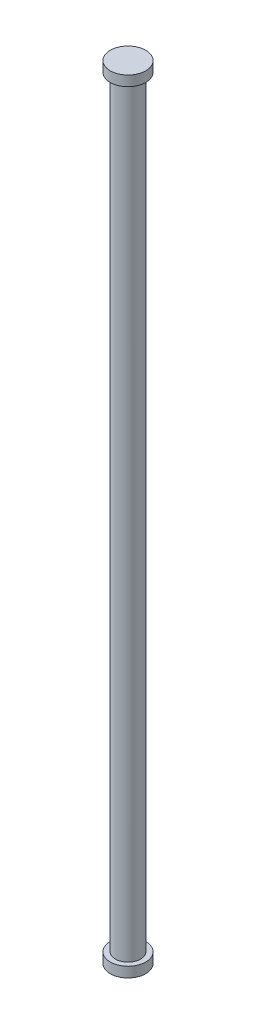
ISO-10303-21;
HEADER;
FILE_DESCRIPTION(('STEP AP214'),'2;1');
FILE_NAME('part.step','',(''),(''),'','','');
FILE_SCHEMA(('AUTOMOTIVE_DESIGN { 1 0 10303 214 1 1 1 1 }'));
ENDSEC;
DATA;
#1=APPLICATION_CONTEXT('core data for automotive mechanical design processes');
#2=APPLICATION_PROTOCOL_DEFINITION('international standard','automotive_design',2000,#1);
#3=PRODUCT_CONTEXT('',#1,'mechanical');
#4=PRODUCT('Part','Part','',(#3));
#5=PRODUCT_RELATED_PRODUCT_CATEGORY('part','',(#4));
#6=PRODUCT_DEFINITION_FORMATION('','',#4);
#7=PRODUCT_DEFINITION_CONTEXT('part definition',#1,'design');
#8=PRODUCT_DEFINITION('design','',#6,#7);
#9=PRODUCT_DEFINITION_SHAPE('','',#8);
#10=(LENGTH_UNIT() NAMED_UNIT(*) SI_UNIT(.MILLI.,.METRE.));
#11=(NAMED_UNIT(*) PLANE_ANGLE_UNIT() SI_UNIT($,.RADIAN.));
#12=(NAMED_UNIT(*) SI_UNIT($,.STERADIAN.) SOLID_ANGLE_UNIT());
#13=UNCERTAINTY_MEASURE_WITH_UNIT(LENGTH_MEASURE(1.E-05),#10,'distance_accuracy_value','');
#14=(GEOMETRIC_REPRESENTATION_CONTEXT(3) GLOBAL_UNCERTAINTY_ASSIGNED_CONTEXT((#13)) GLOBAL_UNIT_ASSIGNED_CONTEXT((#10,
#11,#12)) REPRESENTATION_CONTEXT('',''));
#15=CARTESIAN_POINT('',(0.,0.,0.));
#16=DIRECTION('',(0.,0.,1.));
#17=DIRECTION('',(1.,0.,0.));
#18=AXIS2_PLACEMENT_3D('',#15,#16,#17);
#19=CARTESIAN_POINT('',(0.,154.,0.));
#20=DIRECTION('',(0.,-1.,0.));
#21=DIRECTION('',(0.,0.,-1.));
#22=AXIS2_PLACEMENT_3D('',#19,#20,#21);
#23=CYLINDRICAL_SURFACE('',#22,2.5);
#24=CARTESIAN_POINT('',(0.,2.,0.));
#25=DIRECTION('',(0.,-1.,0.));
#26=DIRECTION('',(0.,0.,-1.));
#27=AXIS2_PLACEMENT_3D('',#24,#25,#26);
#28=CIRCLE('',#27,2.5);
#29=CARTESIAN_POINT('',(0.,2.,-2.5));
#30=VERTEX_POINT('',#29);
#31=EDGE_CURVE('E44',#30,#30,#28,.T.);
#32=ORIENTED_EDGE('',*,*,#31,.F.);
#33=EDGE_LOOP('',(#32));
#34=FACE_BOUND('',#33,.T.);
#35=CARTESIAN_POINT('',(0.,152.,0.));
#36=DIRECTION('',(0.,1.,0.));
#37=DIRECTION('',(0.,0.,1.));
#38=AXIS2_PLACEMENT_3D('',#35,#36,#37);
#39=CIRCLE('',#38,2.5);
#40=CARTESIAN_POINT('',(0.,152.,2.5));
#41=VERTEX_POINT('',#40);
#42=EDGE_CURVE('E10',#41,#41,#39,.T.);
#43=ORIENTED_EDGE('',*,*,#42,.F.);
#44=EDGE_LOOP('',(#43));
#45=FACE_BOUND('',#44,.T.);
#46=ADVANCED_FACE('F37',(#34,#45),#23,.T.);
#47=CARTESIAN_POINT('',(0.,2.,0.));
#48=DIRECTION('',(0.,-1.,0.));
#49=DIRECTION('',(0.,0.,-1.));
#50=AXIS2_PLACEMENT_3D('',#47,#48,#49);
#51=CYLINDRICAL_SURFACE('',#50,3.5);
#52=CARTESIAN_POINT('',(0.,2.,0.));
#53=DIRECTION('',(0.,-1.,0.));
#54=DIRECTION('',(0.,0.,-1.));
#55=AXIS2_PLACEMENT_3D('',#52,#53,#54);
#56=CIRCLE('',#55,3.5);
#57=CARTESIAN_POINT('',(0.,2.,-3.5));
#58=VERTEX_POINT('',#57);
#59=EDGE_CURVE('E49',#58,#58,#56,.T.);
#60=ORIENTED_EDGE('',*,*,#59,.T.);
#61=EDGE_LOOP('',(#60));
#62=FACE_BOUND('',#61,.T.);
#63=CARTESIAN_POINT('',(0.,0.,0.));
#64=DIRECTION('',(0.,-1.,0.));
#65=DIRECTION('',(0.,0.,-1.));
#66=AXIS2_PLACEMENT_3D('',#63,#64,#65);
#67=CIRCLE('',#66,3.5);
#68=CARTESIAN_POINT('',(0.,0.,-3.5));
#69=VERTEX_POINT('',#68);
#70=EDGE_CURVE('E54',#69,#69,#67,.T.);
#71=ORIENTED_EDGE('',*,*,#70,.F.);
#72=EDGE_LOOP('',(#71));
#73=FACE_BOUND('',#72,.T.);
#74=ADVANCED_FACE('F85',(#62,#73),#51,.T.);
#75=CARTESIAN_POINT('',(0.,2.,0.));
#76=DIRECTION('',(0.,-1.,0.));
#77=DIRECTION('',(0.,0.,-1.));
#78=AXIS2_PLACEMENT_3D('',#75,#76,#77);
#79=PLANE('',#78);
#80=ORIENTED_EDGE('',*,*,#31,.T.);
#81=EDGE_LOOP('',(#80));
#82=FACE_BOUND('',#81,.T.);
#83=ORIENTED_EDGE('',*,*,#59,.F.);
#84=EDGE_LOOP('',(#83));
#85=FACE_BOUND('',#84,.T.);
#86=ADVANCED_FACE('F90',(#82,#85),#79,.F.);
#87=CARTESIAN_POINT('',(0.,0.,0.));
#88=DIRECTION('',(0.,1.,0.));
#89=DIRECTION('',(0.,0.,1.));
#90=AXIS2_PLACEMENT_3D('',#87,#88,#89);
#91=PLANE('',#90);
#92=ORIENTED_EDGE('',*,*,#70,.T.);
#93=EDGE_LOOP('',(#92));
#94=FACE_BOUND('',#93,.T.);
#95=ADVANCED_FACE('F82',(#94),#91,.F.);
#96=CARTESIAN_POINT('',(0.,152.,0.));
#97=DIRECTION('',(0.,1.,0.));
#98=DIRECTION('',(0.,0.,1.));
#99=AXIS2_PLACEMENT_3D('',#96,#97,#98);
#100=CYLINDRICAL_SURFACE('',#99,3.5);
#101=CARTESIAN_POINT('',(0.,152.,0.));
#102=DIRECTION('',(0.,1.,0.));
#103=DIRECTION('',(0.,0.,1.));
#104=AXIS2_PLACEMENT_3D('',#101,#102,#103);
#105=CIRCLE('',#104,3.5);
#106=CARTESIAN_POINT('',(0.,152.,3.5));
#107=VERTEX_POINT('',#106);
#108=EDGE_CURVE('E59',#107,#107,#105,.T.);
#109=ORIENTED_EDGE('',*,*,#108,.T.);
#110=EDGE_LOOP('',(#109));
#111=FACE_BOUND('',#110,.T.);
#112=CARTESIAN_POINT('',(0.,154.,0.));
#113=DIRECTION('',(0.,1.,0.));
#114=DIRECTION('',(0.,0.,1.));
#115=AXIS2_PLACEMENT_3D('',#112,#113,#114);
#116=CIRCLE('',#115,3.5);
#117=CARTESIAN_POINT('',(0.,154.,3.5));
#118=VERTEX_POINT('',#117);
#119=EDGE_CURVE('E61',#118,#118,#116,.T.);
#120=ORIENTED_EDGE('',*,*,#119,.F.);
#121=EDGE_LOOP('',(#120));
#122=FACE_BOUND('',#121,.T.);
#123=ADVANCED_FACE('F69',(#111,#122),#100,.T.);
#124=CARTESIAN_POINT('',(0.,152.,0.));
#125=DIRECTION('',(0.,1.,0.));
#126=DIRECTION('',(0.,0.,1.));
#127=AXIS2_PLACEMENT_3D('',#124,#125,#126);
#128=PLANE('',#127);
#129=ORIENTED_EDGE('',*,*,#42,.T.);
#130=EDGE_LOOP('',(#129));
#131=FACE_BOUND('',#130,.T.);
#132=ORIENTED_EDGE('',*,*,#108,.F.);
#133=EDGE_LOOP('',(#132));
#134=FACE_BOUND('',#133,.T.);
#135=ADVANCED_FACE('F72',(#131,#134),#128,.F.);
#136=CARTESIAN_POINT('',(0.,154.,0.));
#137=DIRECTION('',(0.,1.,0.));
#138=DIRECTION('',(0.,0.,1.));
#139=AXIS2_PLACEMENT_3D('',#136,#137,#138);
#140=PLANE('',#139);
#141=ORIENTED_EDGE('',*,*,#119,.T.);
#142=EDGE_LOOP('',(#141));
#143=FACE_BOUND('',#142,.T.);
#144=ADVANCED_FACE('F74',(#143),#140,.T.);
#145=CLOSED_SHELL('',(#46,#74,#86,#95,#123,#135,#144));
#146=MANIFOLD_SOLID_BREP('B2',#145);
#147=ADVANCED_BREP_SHAPE_REPRESENTATION('',(#18,#146),#14);
#148=SHAPE_DEFINITION_REPRESENTATION(#9,#147);
ENDSEC;
END-ISO-10303-21;
